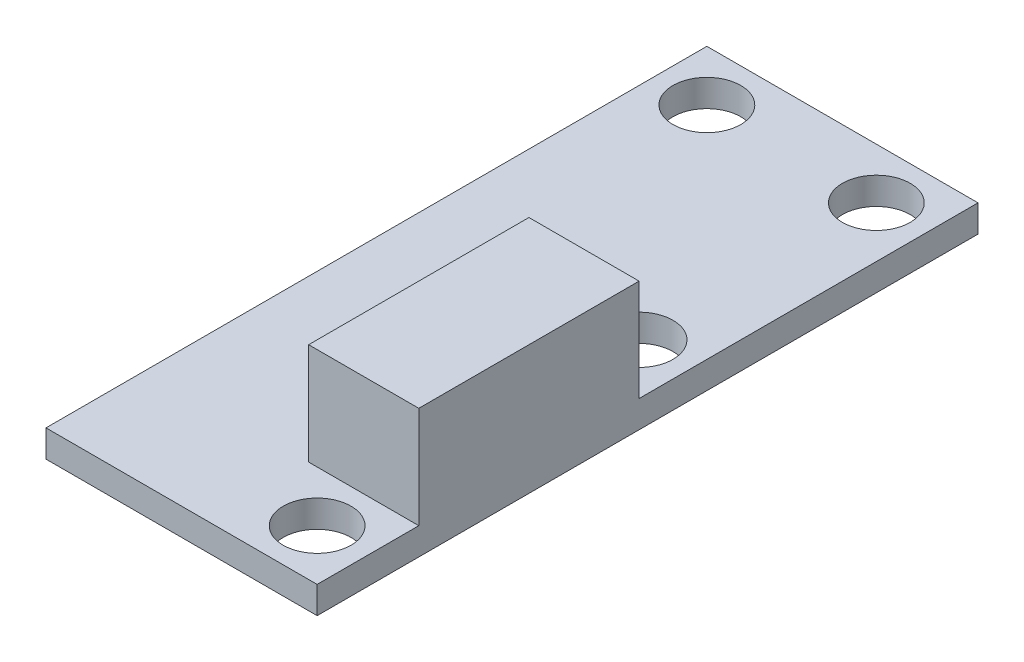
ISO-10303-21;
HEADER;
FILE_DESCRIPTION(('STEP AP214'),'2;1');
FILE_NAME('part.step','',(''),(''),'','','');
FILE_SCHEMA(('AUTOMOTIVE_DESIGN { 1 0 10303 214 1 1 1 1 }'));
ENDSEC;
DATA;
#1=APPLICATION_CONTEXT('core data for automotive mechanical design processes');
#2=APPLICATION_PROTOCOL_DEFINITION('international standard','automotive_design',2000,#1);
#3=PRODUCT_CONTEXT('',#1,'mechanical');
#4=PRODUCT('Part','Part','',(#3));
#5=PRODUCT_RELATED_PRODUCT_CATEGORY('part','',(#4));
#6=PRODUCT_DEFINITION_FORMATION('','',#4);
#7=PRODUCT_DEFINITION_CONTEXT('part definition',#1,'design');
#8=PRODUCT_DEFINITION('design','',#6,#7);
#9=PRODUCT_DEFINITION_SHAPE('','',#8);
#10=(LENGTH_UNIT() NAMED_UNIT(*) SI_UNIT(.MILLI.,.METRE.));
#11=(NAMED_UNIT(*) PLANE_ANGLE_UNIT() SI_UNIT($,.RADIAN.));
#12=(NAMED_UNIT(*) SI_UNIT($,.STERADIAN.) SOLID_ANGLE_UNIT());
#13=UNCERTAINTY_MEASURE_WITH_UNIT(LENGTH_MEASURE(1.E-05),#10,'distance_accuracy_value','');
#14=(GEOMETRIC_REPRESENTATION_CONTEXT(3) GLOBAL_UNCERTAINTY_ASSIGNED_CONTEXT((#13)) GLOBAL_UNIT_ASSIGNED_CONTEXT((#10,
#11,#12)) REPRESENTATION_CONTEXT('',''));
#15=CARTESIAN_POINT('',(0.,0.,0.));
#16=DIRECTION('',(0.,0.,1.));
#17=DIRECTION('',(1.,0.,0.));
#18=AXIS2_PLACEMENT_3D('',#15,#16,#17);
#19=CARTESIAN_POINT('',(0.,0.8,0.));
#20=DIRECTION('',(0.,-1.,0.));
#21=DIRECTION('',(0.,0.,-1.));
#22=AXIS2_PLACEMENT_3D('',#19,#20,#21);
#23=PLANE('',#22);
#24=CARTESIAN_POINT('',(-5.,0.8,-16.5));
#25=DIRECTION('',(0.,1.,0.));
#26=DIRECTION('',(0.,0.,1.));
#27=AXIS2_PLACEMENT_3D('',#24,#25,#26);
#28=CIRCLE('',#27,2.);
#29=CARTESIAN_POINT('',(-5.,0.8,-14.5));
#30=VERTEX_POINT('',#29);
#31=EDGE_CURVE('E124',#30,#30,#28,.T.);
#32=ORIENTED_EDGE('',*,*,#31,.F.);
#33=EDGE_LOOP('',(#32));
#34=FACE_BOUND('',#33,.T.);
#35=CARTESIAN_POINT('',(5.,0.8,-2.49999999999998));
#36=DIRECTION('',(0.,1.,0.));
#37=DIRECTION('',(0.,0.,1.));
#38=AXIS2_PLACEMENT_3D('',#35,#36,#37);
#39=CIRCLE('',#38,2.);
#40=CARTESIAN_POINT('',(5.,0.8,-0.499999999999981));
#41=VERTEX_POINT('',#40);
#42=EDGE_CURVE('E152',#41,#41,#39,.T.);
#43=ORIENTED_EDGE('',*,*,#42,.F.);
#44=EDGE_LOOP('',(#43));
#45=FACE_BOUND('',#44,.T.);
#46=CARTESIAN_POINT('',(5.,0.8,16.5));
#47=DIRECTION('',(0.,1.,0.));
#48=DIRECTION('',(0.,0.,1.));
#49=AXIS2_PLACEMENT_3D('',#46,#47,#48);
#50=CIRCLE('',#49,2.);
#51=CARTESIAN_POINT('',(5.,0.8,18.5));
#52=VERTEX_POINT('',#51);
#53=EDGE_CURVE('E158',#52,#52,#50,.T.);
#54=ORIENTED_EDGE('',*,*,#53,.F.);
#55=EDGE_LOOP('',(#54));
#56=FACE_BOUND('',#55,.T.);
#57=CARTESIAN_POINT('',(5.,0.8,-16.5));
#58=DIRECTION('',(0.,1.,0.));
#59=DIRECTION('',(0.,0.,1.));
#60=AXIS2_PLACEMENT_3D('',#57,#58,#59);
#61=CIRCLE('',#60,2.);
#62=CARTESIAN_POINT('',(5.,0.8,-14.5));
#63=VERTEX_POINT('',#62);
#64=EDGE_CURVE('E146',#63,#63,#61,.T.);
#65=ORIENTED_EDGE('',*,*,#64,.F.);
#66=EDGE_LOOP('',(#65));
#67=FACE_BOUND('',#66,.T.);
#68=DIRECTION('',(1.,0.,0.));
#69=VECTOR('',#68,1.);
#70=CARTESIAN_POINT('',(8.,0.8,13.5));
#71=LINE('',#70,#69);
#72=CARTESIAN_POINT('',(1.5,0.8,13.5));
#73=VERTEX_POINT('',#72);
#74=CARTESIAN_POINT('',(8.,0.8,13.5));
#75=VERTEX_POINT('',#74);
#76=EDGE_CURVE('E49',#73,#75,#71,.T.);
#77=ORIENTED_EDGE('',*,*,#76,.F.);
#78=DIRECTION('',(0.,0.,1.));
#79=VECTOR('',#78,1.);
#80=CARTESIAN_POINT('',(1.5,0.8,0.500000000000019));
#81=LINE('',#80,#79);
#82=CARTESIAN_POINT('',(1.5,0.8,0.500000000000019));
#83=VERTEX_POINT('',#82);
#84=EDGE_CURVE('E135',#83,#73,#81,.T.);
#85=ORIENTED_EDGE('',*,*,#84,.F.);
#86=DIRECTION('',(-1.,0.,0.));
#87=VECTOR('',#86,1.);
#88=CARTESIAN_POINT('',(8.,0.8,0.500000000000018));
#89=LINE('',#88,#87);
#90=CARTESIAN_POINT('',(8.,0.8,0.500000000000018));
#91=VERTEX_POINT('',#90);
#92=EDGE_CURVE('E55',#91,#83,#89,.T.);
#93=ORIENTED_EDGE('',*,*,#92,.F.);
#94=DIRECTION('',(0.,0.,-1.));
#95=VECTOR('',#94,1.);
#96=CARTESIAN_POINT('',(7.99999999999999,0.8,-19.5));
#97=LINE('',#96,#95);
#98=CARTESIAN_POINT('',(7.99999999999999,0.8,-19.5));
#99=VERTEX_POINT('',#98);
#100=EDGE_CURVE('E120',#91,#99,#97,.T.);
#101=ORIENTED_EDGE('',*,*,#100,.T.);
#102=DIRECTION('',(-1.,0.,0.));
#103=VECTOR('',#102,1.);
#104=CARTESIAN_POINT('',(7.99999999999999,0.8,-19.5));
#105=LINE('',#104,#103);
#106=CARTESIAN_POINT('',(-8.00000000000001,0.8,-19.5));
#107=VERTEX_POINT('',#106);
#108=EDGE_CURVE('E172',#99,#107,#105,.T.);
#109=ORIENTED_EDGE('',*,*,#108,.T.);
#110=DIRECTION('',(0.,0.,1.));
#111=VECTOR('',#110,1.);
#112=CARTESIAN_POINT('',(-8.00000000000001,0.8,-19.5));
#113=LINE('',#112,#111);
#114=CARTESIAN_POINT('',(-8.,0.8,19.5));
#115=VERTEX_POINT('',#114);
#116=EDGE_CURVE('E164',#107,#115,#113,.T.);
#117=ORIENTED_EDGE('',*,*,#116,.T.);
#118=DIRECTION('',(1.,0.,0.));
#119=VECTOR('',#118,1.);
#120=CARTESIAN_POINT('',(8.,0.8,19.5));
#121=LINE('',#120,#119);
#122=CARTESIAN_POINT('',(8.,0.8,19.5));
#123=VERTEX_POINT('',#122);
#124=EDGE_CURVE('E167',#115,#123,#121,.T.);
#125=ORIENTED_EDGE('',*,*,#124,.T.);
#126=EDGE_CURVE('E177',#123,#75,#97,.T.);
#127=ORIENTED_EDGE('',*,*,#126,.T.);
#128=EDGE_LOOP('',(#77,#85,#93,#101,#109,#117,#125,#127));
#129=FACE_BOUND('',#128,.T.);
#130=ADVANCED_FACE('F32',(#34,#45,#56,#67,#129),#23,.F.);
#131=CARTESIAN_POINT('',(0.,-0.8,0.));
#132=DIRECTION('',(0.,-1.,0.));
#133=DIRECTION('',(0.,0.,-1.));
#134=AXIS2_PLACEMENT_3D('',#131,#132,#133);
#135=PLANE('',#134);
#136=CARTESIAN_POINT('',(5.,-0.8,-16.5));
#137=DIRECTION('',(0.,1.,0.));
#138=DIRECTION('',(0.,0.,1.));
#139=AXIS2_PLACEMENT_3D('',#136,#137,#138);
#140=CIRCLE('',#139,2.);
#141=CARTESIAN_POINT('',(5.,-0.8,-14.5));
#142=VERTEX_POINT('',#141);
#143=EDGE_CURVE('E144',#142,#142,#140,.T.);
#144=ORIENTED_EDGE('',*,*,#143,.T.);
#145=EDGE_LOOP('',(#144));
#146=FACE_BOUND('',#145,.T.);
#147=CARTESIAN_POINT('',(5.,-0.8,16.5));
#148=DIRECTION('',(0.,1.,0.));
#149=DIRECTION('',(0.,0.,1.));
#150=AXIS2_PLACEMENT_3D('',#147,#148,#149);
#151=CIRCLE('',#150,2.);
#152=CARTESIAN_POINT('',(5.,-0.8,18.5));
#153=VERTEX_POINT('',#152);
#154=EDGE_CURVE('E155',#153,#153,#151,.T.);
#155=ORIENTED_EDGE('',*,*,#154,.T.);
#156=EDGE_LOOP('',(#155));
#157=FACE_BOUND('',#156,.T.);
#158=DIRECTION('',(0.,0.,1.));
#159=VECTOR('',#158,1.);
#160=CARTESIAN_POINT('',(-8.00000000000001,-0.8,-19.5));
#161=LINE('',#160,#159);
#162=CARTESIAN_POINT('',(-8.00000000000001,-0.8,-19.5));
#163=VERTEX_POINT('',#162);
#164=CARTESIAN_POINT('',(-8.,-0.8,19.5));
#165=VERTEX_POINT('',#164);
#166=EDGE_CURVE('E161',#163,#165,#161,.T.);
#167=ORIENTED_EDGE('',*,*,#166,.F.);
#168=DIRECTION('',(-1.,0.,0.));
#169=VECTOR('',#168,1.);
#170=CARTESIAN_POINT('',(7.99999999999999,-0.8,-19.5));
#171=LINE('',#170,#169);
#172=CARTESIAN_POINT('',(7.99999999999999,-0.8,-19.5));
#173=VERTEX_POINT('',#172);
#174=EDGE_CURVE('E168',#173,#163,#171,.T.);
#175=ORIENTED_EDGE('',*,*,#174,.F.);
#176=DIRECTION('',(0.,0.,-1.));
#177=VECTOR('',#176,1.);
#178=CARTESIAN_POINT('',(7.99999999999999,-0.8,-19.5));
#179=LINE('',#178,#177);
#180=CARTESIAN_POINT('',(8.,-0.8,19.5));
#181=VERTEX_POINT('',#180);
#182=EDGE_CURVE('E188',#181,#173,#179,.T.);
#183=ORIENTED_EDGE('',*,*,#182,.F.);
#184=DIRECTION('',(1.,0.,0.));
#185=VECTOR('',#184,1.);
#186=CARTESIAN_POINT('',(8.,-0.8,19.5));
#187=LINE('',#186,#185);
#188=EDGE_CURVE('E190',#165,#181,#187,.T.);
#189=ORIENTED_EDGE('',*,*,#188,.F.);
#190=EDGE_LOOP('',(#167,#175,#183,#189));
#191=FACE_BOUND('',#190,.T.);
#192=CARTESIAN_POINT('',(5.,-0.8,-2.49999999999998));
#193=DIRECTION('',(0.,1.,0.));
#194=DIRECTION('',(0.,0.,1.));
#195=AXIS2_PLACEMENT_3D('',#192,#193,#194);
#196=CIRCLE('',#195,2.);
#197=CARTESIAN_POINT('',(5.,-0.8,-0.499999999999981));
#198=VERTEX_POINT('',#197);
#199=EDGE_CURVE('E149',#198,#198,#196,.T.);
#200=ORIENTED_EDGE('',*,*,#199,.T.);
#201=EDGE_LOOP('',(#200));
#202=FACE_BOUND('',#201,.T.);
#203=CARTESIAN_POINT('',(-5.,-0.8,-16.5));
#204=DIRECTION('',(0.,1.,0.));
#205=DIRECTION('',(0.,0.,1.));
#206=AXIS2_PLACEMENT_3D('',#203,#204,#205);
#207=CIRCLE('',#206,2.);
#208=CARTESIAN_POINT('',(-5.,-0.8,-14.5));
#209=VERTEX_POINT('',#208);
#210=EDGE_CURVE('E121',#209,#209,#207,.T.);
#211=ORIENTED_EDGE('',*,*,#210,.T.);
#212=EDGE_LOOP('',(#211));
#213=FACE_BOUND('',#212,.T.);
#214=ADVANCED_FACE('F199',(#146,#157,#191,#202,#213),#135,.T.);
#215=CARTESIAN_POINT('',(-8.00000000000001,0.8,-19.5));
#216=DIRECTION('',(1.,0.,0.));
#217=DIRECTION('',(0.,0.,-1.));
#218=AXIS2_PLACEMENT_3D('',#215,#216,#217);
#219=PLANE('',#218);
#220=ORIENTED_EDGE('',*,*,#166,.T.);
#221=DIRECTION('',(0.,-1.,0.));
#222=VECTOR('',#221,1.);
#223=CARTESIAN_POINT('',(-8.,0.8,19.5));
#224=LINE('',#223,#222);
#225=EDGE_CURVE('E11',#115,#165,#224,.T.);
#226=ORIENTED_EDGE('',*,*,#225,.F.);
#227=ORIENTED_EDGE('',*,*,#116,.F.);
#228=DIRECTION('',(0.,-1.,0.));
#229=VECTOR('',#228,1.);
#230=CARTESIAN_POINT('',(-8.00000000000001,0.8,-19.5));
#231=LINE('',#230,#229);
#232=EDGE_CURVE('E184',#107,#163,#231,.T.);
#233=ORIENTED_EDGE('',*,*,#232,.T.);
#234=EDGE_LOOP('',(#220,#226,#227,#233));
#235=FACE_BOUND('',#234,.T.);
#236=ADVANCED_FACE('F34',(#235),#219,.F.);
#237=CARTESIAN_POINT('',(8.,0.8,19.5));
#238=DIRECTION('',(0.,0.,-1.));
#239=DIRECTION('',(-1.,0.,0.));
#240=AXIS2_PLACEMENT_3D('',#237,#238,#239);
#241=PLANE('',#240);
#242=ORIENTED_EDGE('',*,*,#188,.T.);
#243=DIRECTION('',(0.,-1.,0.));
#244=VECTOR('',#243,1.);
#245=CARTESIAN_POINT('',(8.,0.8,19.5));
#246=LINE('',#245,#244);
#247=EDGE_CURVE('E41',#123,#181,#246,.T.);
#248=ORIENTED_EDGE('',*,*,#247,.F.);
#249=ORIENTED_EDGE('',*,*,#124,.F.);
#250=ORIENTED_EDGE('',*,*,#225,.T.);
#251=EDGE_LOOP('',(#242,#248,#249,#250));
#252=FACE_BOUND('',#251,.T.);
#253=ADVANCED_FACE('F204',(#252),#241,.F.);
#254=CARTESIAN_POINT('',(7.99999999999999,0.8,-19.5));
#255=DIRECTION('',(-1.,0.,0.));
#256=DIRECTION('',(0.,0.,1.));
#257=AXIS2_PLACEMENT_3D('',#254,#255,#256);
#258=PLANE('',#257);
#259=ORIENTED_EDGE('',*,*,#182,.T.);
#260=DIRECTION('',(0.,-1.,0.));
#261=VECTOR('',#260,1.);
#262=CARTESIAN_POINT('',(7.99999999999999,0.8,-19.5));
#263=LINE('',#262,#261);
#264=EDGE_CURVE('E181',#99,#173,#263,.T.);
#265=ORIENTED_EDGE('',*,*,#264,.F.);
#266=ORIENTED_EDGE('',*,*,#100,.F.);
#267=DIRECTION('',(0.,-1.,0.));
#268=VECTOR('',#267,1.);
#269=CARTESIAN_POINT('',(8.,6.8,0.500000000000018));
#270=LINE('',#269,#268);
#271=CARTESIAN_POINT('',(8.,6.8,0.500000000000018));
#272=VERTEX_POINT('',#271);
#273=EDGE_CURVE('E102',#272,#91,#270,.T.);
#274=ORIENTED_EDGE('',*,*,#273,.F.);
#275=DIRECTION('',(0.,0.,-1.));
#276=VECTOR('',#275,1.);
#277=CARTESIAN_POINT('',(8.,6.8,0.500000000000018));
#278=LINE('',#277,#276);
#279=CARTESIAN_POINT('',(8.,6.8,13.5));
#280=VERTEX_POINT('',#279);
#281=EDGE_CURVE('E108',#280,#272,#278,.T.);
#282=ORIENTED_EDGE('',*,*,#281,.F.);
#283=DIRECTION('',(0.,-1.,0.));
#284=VECTOR('',#283,1.);
#285=CARTESIAN_POINT('',(8.,6.8,13.5));
#286=LINE('',#285,#284);
#287=EDGE_CURVE('E136',#280,#75,#286,.T.);
#288=ORIENTED_EDGE('',*,*,#287,.T.);
#289=ORIENTED_EDGE('',*,*,#126,.F.);
#290=ORIENTED_EDGE('',*,*,#247,.T.);
#291=EDGE_LOOP('',(#259,#265,#266,#274,#282,#288,#289,#290));
#292=FACE_BOUND('',#291,.T.);
#293=ADVANCED_FACE('F118',(#292),#258,.F.);
#294=CARTESIAN_POINT('',(7.99999999999999,0.8,-19.5));
#295=DIRECTION('',(0.,0.,1.));
#296=DIRECTION('',(1.,0.,0.));
#297=AXIS2_PLACEMENT_3D('',#294,#295,#296);
#298=PLANE('',#297);
#299=ORIENTED_EDGE('',*,*,#174,.T.);
#300=ORIENTED_EDGE('',*,*,#232,.F.);
#301=ORIENTED_EDGE('',*,*,#108,.F.);
#302=ORIENTED_EDGE('',*,*,#264,.T.);
#303=EDGE_LOOP('',(#299,#300,#301,#302));
#304=FACE_BOUND('',#303,.T.);
#305=ADVANCED_FACE('F208',(#304),#298,.F.);
#306=CARTESIAN_POINT('',(5.,0.8,16.5));
#307=DIRECTION('',(0.,-1.,0.));
#308=DIRECTION('',(0.,0.,-1.));
#309=AXIS2_PLACEMENT_3D('',#306,#307,#308);
#310=CYLINDRICAL_SURFACE('',#309,2.);
#311=ORIENTED_EDGE('',*,*,#53,.T.);
#312=EDGE_LOOP('',(#311));
#313=FACE_BOUND('',#312,.T.);
#314=ORIENTED_EDGE('',*,*,#154,.F.);
#315=EDGE_LOOP('',(#314));
#316=FACE_BOUND('',#315,.T.);
#317=ADVANCED_FACE('F235',(#313,#316),#310,.F.);
#318=CARTESIAN_POINT('',(5.,0.8,-2.49999999999998));
#319=DIRECTION('',(0.,-1.,0.));
#320=DIRECTION('',(0.,0.,-1.));
#321=AXIS2_PLACEMENT_3D('',#318,#319,#320);
#322=CYLINDRICAL_SURFACE('',#321,2.);
#323=ORIENTED_EDGE('',*,*,#42,.T.);
#324=EDGE_LOOP('',(#323));
#325=FACE_BOUND('',#324,.T.);
#326=ORIENTED_EDGE('',*,*,#199,.F.);
#327=EDGE_LOOP('',(#326));
#328=FACE_BOUND('',#327,.T.);
#329=ADVANCED_FACE('F281',(#325,#328),#322,.F.);
#330=CARTESIAN_POINT('',(5.,0.8,-16.5));
#331=DIRECTION('',(0.,-1.,0.));
#332=DIRECTION('',(0.,0.,-1.));
#333=AXIS2_PLACEMENT_3D('',#330,#331,#332);
#334=CYLINDRICAL_SURFACE('',#333,2.);
#335=ORIENTED_EDGE('',*,*,#64,.T.);
#336=EDGE_LOOP('',(#335));
#337=FACE_BOUND('',#336,.T.);
#338=ORIENTED_EDGE('',*,*,#143,.F.);
#339=EDGE_LOOP('',(#338));
#340=FACE_BOUND('',#339,.T.);
#341=ADVANCED_FACE('F289',(#337,#340),#334,.F.);
#342=CARTESIAN_POINT('',(-5.,0.8,-16.5));
#343=DIRECTION('',(0.,-1.,0.));
#344=DIRECTION('',(0.,0.,-1.));
#345=AXIS2_PLACEMENT_3D('',#342,#343,#344);
#346=CYLINDRICAL_SURFACE('',#345,2.);
#347=ORIENTED_EDGE('',*,*,#31,.T.);
#348=EDGE_LOOP('',(#347));
#349=FACE_BOUND('',#348,.T.);
#350=ORIENTED_EDGE('',*,*,#210,.F.);
#351=EDGE_LOOP('',(#350));
#352=FACE_BOUND('',#351,.T.);
#353=ADVANCED_FACE('F222',(#349,#352),#346,.F.);
#354=CARTESIAN_POINT('',(8.,6.8,0.500000000000018));
#355=DIRECTION('',(0.,0.,1.));
#356=DIRECTION('',(1.,0.,0.));
#357=AXIS2_PLACEMENT_3D('',#354,#355,#356);
#358=PLANE('',#357);
#359=ORIENTED_EDGE('',*,*,#92,.T.);
#360=DIRECTION('',(0.,-1.,0.));
#361=VECTOR('',#360,1.);
#362=CARTESIAN_POINT('',(1.5,6.8,0.500000000000019));
#363=LINE('',#362,#361);
#364=CARTESIAN_POINT('',(1.5,6.8,0.500000000000019));
#365=VERTEX_POINT('',#364);
#366=EDGE_CURVE('E104',#365,#83,#363,.T.);
#367=ORIENTED_EDGE('',*,*,#366,.F.);
#368=DIRECTION('',(-1.,0.,0.));
#369=VECTOR('',#368,1.);
#370=CARTESIAN_POINT('',(8.,6.8,0.500000000000018));
#371=LINE('',#370,#369);
#372=EDGE_CURVE('E98',#272,#365,#371,.T.);
#373=ORIENTED_EDGE('',*,*,#372,.F.);
#374=ORIENTED_EDGE('',*,*,#273,.T.);
#375=EDGE_LOOP('',(#359,#367,#373,#374));
#376=FACE_BOUND('',#375,.T.);
#377=ADVANCED_FACE('F100',(#376),#358,.F.);
#378=CARTESIAN_POINT('',(1.5,6.8,0.500000000000019));
#379=DIRECTION('',(1.,0.,0.));
#380=DIRECTION('',(0.,0.,-1.));
#381=AXIS2_PLACEMENT_3D('',#378,#379,#380);
#382=PLANE('',#381);
#383=ORIENTED_EDGE('',*,*,#84,.T.);
#384=DIRECTION('',(0.,-1.,0.));
#385=VECTOR('',#384,1.);
#386=CARTESIAN_POINT('',(1.5,6.8,13.5));
#387=LINE('',#386,#385);
#388=CARTESIAN_POINT('',(1.5,6.8,13.5));
#389=VERTEX_POINT('',#388);
#390=EDGE_CURVE('E126',#389,#73,#387,.T.);
#391=ORIENTED_EDGE('',*,*,#390,.F.);
#392=DIRECTION('',(0.,0.,1.));
#393=VECTOR('',#392,1.);
#394=CARTESIAN_POINT('',(1.5,6.8,0.500000000000019));
#395=LINE('',#394,#393);
#396=EDGE_CURVE('E107',#365,#389,#395,.T.);
#397=ORIENTED_EDGE('',*,*,#396,.F.);
#398=ORIENTED_EDGE('',*,*,#366,.T.);
#399=EDGE_LOOP('',(#383,#391,#397,#398));
#400=FACE_BOUND('',#399,.T.);
#401=ADVANCED_FACE('F213',(#400),#382,.F.);
#402=CARTESIAN_POINT('',(8.,6.8,13.5));
#403=DIRECTION('',(0.,0.,-1.));
#404=DIRECTION('',(-1.,0.,0.));
#405=AXIS2_PLACEMENT_3D('',#402,#403,#404);
#406=PLANE('',#405);
#407=ORIENTED_EDGE('',*,*,#76,.T.);
#408=ORIENTED_EDGE('',*,*,#287,.F.);
#409=DIRECTION('',(1.,0.,0.));
#410=VECTOR('',#409,1.);
#411=CARTESIAN_POINT('',(8.,6.8,13.5));
#412=LINE('',#411,#410);
#413=EDGE_CURVE('E113',#389,#280,#412,.T.);
#414=ORIENTED_EDGE('',*,*,#413,.F.);
#415=ORIENTED_EDGE('',*,*,#390,.T.);
#416=EDGE_LOOP('',(#407,#408,#414,#415));
#417=FACE_BOUND('',#416,.T.);
#418=ADVANCED_FACE('F210',(#417),#406,.F.);
#419=CARTESIAN_POINT('',(0.,6.8,0.));
#420=DIRECTION('',(0.,-1.,0.));
#421=DIRECTION('',(0.,0.,-1.));
#422=AXIS2_PLACEMENT_3D('',#419,#420,#421);
#423=PLANE('',#422);
#424=ORIENTED_EDGE('',*,*,#281,.T.);
#425=ORIENTED_EDGE('',*,*,#372,.T.);
#426=ORIENTED_EDGE('',*,*,#396,.T.);
#427=ORIENTED_EDGE('',*,*,#413,.T.);
#428=EDGE_LOOP('',(#424,#425,#426,#427));
#429=FACE_BOUND('',#428,.T.);
#430=ADVANCED_FACE('F111',(#429),#423,.F.);
#431=CLOSED_SHELL('',(#130,#214,#236,#253,#293,#305,#317,#329,#341,#353,#377,#401,#418,#430));
#432=MANIFOLD_SOLID_BREP('B2',#431);
#433=ADVANCED_BREP_SHAPE_REPRESENTATION('',(#18,#432),#14);
#434=SHAPE_DEFINITION_REPRESENTATION(#9,#433);
ENDSEC;
END-ISO-10303-21;
